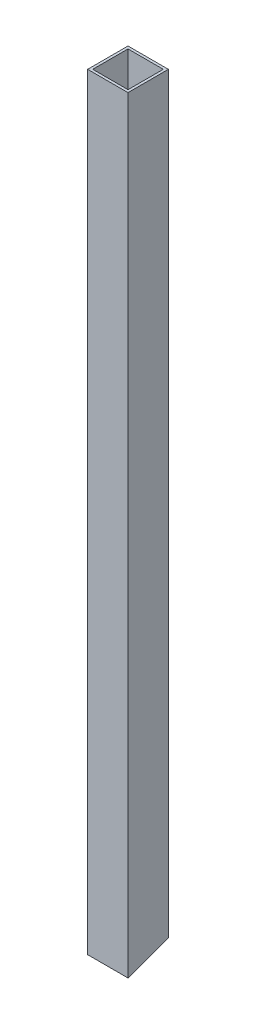
ISO-10303-21;
HEADER;
FILE_DESCRIPTION(('STEP AP214'),'2;1');
FILE_NAME('part.step','',(''),(''),'','','');
FILE_SCHEMA(('AUTOMOTIVE_DESIGN { 1 0 10303 214 1 1 1 1 }'));
ENDSEC;
DATA;
#1=APPLICATION_CONTEXT('core data for automotive mechanical design processes');
#2=APPLICATION_PROTOCOL_DEFINITION('international standard','automotive_design',2000,#1);
#3=PRODUCT_CONTEXT('',#1,'mechanical');
#4=PRODUCT('Part','Part','',(#3));
#5=PRODUCT_RELATED_PRODUCT_CATEGORY('part','',(#4));
#6=PRODUCT_DEFINITION_FORMATION('','',#4);
#7=PRODUCT_DEFINITION_CONTEXT('part definition',#1,'design');
#8=PRODUCT_DEFINITION('design','',#6,#7);
#9=PRODUCT_DEFINITION_SHAPE('','',#8);
#10=(LENGTH_UNIT() NAMED_UNIT(*) SI_UNIT(.MILLI.,.METRE.));
#11=(NAMED_UNIT(*) PLANE_ANGLE_UNIT() SI_UNIT($,.RADIAN.));
#12=(NAMED_UNIT(*) SI_UNIT($,.STERADIAN.) SOLID_ANGLE_UNIT());
#13=UNCERTAINTY_MEASURE_WITH_UNIT(LENGTH_MEASURE(1.E-05),#10,'distance_accuracy_value','');
#14=(GEOMETRIC_REPRESENTATION_CONTEXT(3) GLOBAL_UNCERTAINTY_ASSIGNED_CONTEXT((#13)) GLOBAL_UNIT_ASSIGNED_CONTEXT((#10,
#11,#12)) REPRESENTATION_CONTEXT('',''));
#15=CARTESIAN_POINT('',(0.,0.,0.));
#16=DIRECTION('',(0.,0.,1.));
#17=DIRECTION('',(1.,0.,0.));
#18=AXIS2_PLACEMENT_3D('',#15,#16,#17);
#19=CARTESIAN_POINT('',(0.,482.6,0.));
#20=DIRECTION('',(0.,-1.,0.));
#21=DIRECTION('',(0.,0.,-1.));
#22=AXIS2_PLACEMENT_3D('',#19,#20,#21);
#23=PLANE('',#22);
#24=DIRECTION('',(0.,0.,1.));
#25=VECTOR('',#24,1.);
#26=CARTESIAN_POINT('',(-12.7,482.6,-12.7));
#27=LINE('',#26,#25);
#28=CARTESIAN_POINT('',(-12.7,482.6,-12.7));
#29=VERTEX_POINT('',#28);
#30=CARTESIAN_POINT('',(-12.7,482.6,12.7));
#31=VERTEX_POINT('',#30);
#32=EDGE_CURVE('E130',#29,#31,#27,.T.);
#33=ORIENTED_EDGE('',*,*,#32,.T.);
#34=DIRECTION('',(1.,0.,0.));
#35=VECTOR('',#34,1.);
#36=CARTESIAN_POINT('',(12.7,482.6,12.7));
#37=LINE('',#36,#35);
#38=CARTESIAN_POINT('',(12.7,482.6,12.7));
#39=VERTEX_POINT('',#38);
#40=EDGE_CURVE('E126',#31,#39,#37,.T.);
#41=ORIENTED_EDGE('',*,*,#40,.T.);
#42=DIRECTION('',(0.,0.,-1.));
#43=VECTOR('',#42,1.);
#44=CARTESIAN_POINT('',(12.7,482.6,-12.7));
#45=LINE('',#44,#43);
#46=CARTESIAN_POINT('',(12.7,482.6,-12.7));
#47=VERTEX_POINT('',#46);
#48=EDGE_CURVE('E160',#39,#47,#45,.T.);
#49=ORIENTED_EDGE('',*,*,#48,.T.);
#50=DIRECTION('',(-1.,0.,0.));
#51=VECTOR('',#50,1.);
#52=CARTESIAN_POINT('',(12.7,482.6,-12.7));
#53=LINE('',#52,#51);
#54=EDGE_CURVE('E115',#47,#29,#53,.T.);
#55=ORIENTED_EDGE('',*,*,#54,.T.);
#56=EDGE_LOOP('',(#33,#41,#49,#55));
#57=FACE_BOUND('',#56,.T.);
#58=DIRECTION('',(0.,0.,1.));
#59=VECTOR('',#58,1.);
#60=CARTESIAN_POINT('',(-11.1125,482.6,11.1125));
#61=LINE('',#60,#59);
#62=CARTESIAN_POINT('',(-11.1125,482.6,-11.1125));
#63=VERTEX_POINT('',#62);
#64=CARTESIAN_POINT('',(-11.1125,482.6,11.1125));
#65=VERTEX_POINT('',#64);
#66=EDGE_CURVE('E131',#63,#65,#61,.T.);
#67=ORIENTED_EDGE('',*,*,#66,.F.);
#68=DIRECTION('',(-1.,0.,0.));
#69=VECTOR('',#68,1.);
#70=CARTESIAN_POINT('',(11.1125,482.6,-11.1125));
#71=LINE('',#70,#69);
#72=CARTESIAN_POINT('',(11.1125,482.6,-11.1125));
#73=VERTEX_POINT('',#72);
#74=EDGE_CURVE('E144',#73,#63,#71,.T.);
#75=ORIENTED_EDGE('',*,*,#74,.F.);
#76=DIRECTION('',(0.,0.,-1.));
#77=VECTOR('',#76,1.);
#78=CARTESIAN_POINT('',(11.1125,482.6,11.1125));
#79=LINE('',#78,#77);
#80=CARTESIAN_POINT('',(11.1125,482.6,11.1125));
#81=VERTEX_POINT('',#80);
#82=EDGE_CURVE('E141',#81,#73,#79,.T.);
#83=ORIENTED_EDGE('',*,*,#82,.F.);
#84=DIRECTION('',(1.,0.,0.));
#85=VECTOR('',#84,1.);
#86=CARTESIAN_POINT('',(11.1125,482.6,11.1125));
#87=LINE('',#86,#85);
#88=EDGE_CURVE('E134',#65,#81,#87,.T.);
#89=ORIENTED_EDGE('',*,*,#88,.F.);
#90=EDGE_LOOP('',(#67,#75,#83,#89));
#91=FACE_BOUND('',#90,.T.);
#92=ADVANCED_FACE('F33',(#57,#91),#23,.F.);
#93=CARTESIAN_POINT('',(-12.7,482.6,-12.7));
#94=DIRECTION('',(1.,0.,0.));
#95=DIRECTION('',(0.,0.,-1.));
#96=AXIS2_PLACEMENT_3D('',#93,#94,#95);
#97=PLANE('',#96);
#98=DIRECTION('',(0.,-1.,0.));
#99=VECTOR('',#98,1.);
#100=CARTESIAN_POINT('',(-12.7,482.6,-12.7));
#101=LINE('',#100,#99);
#102=CARTESIAN_POINT('',(-12.7,9.24484395036146,-12.7));
#103=VERTEX_POINT('',#102);
#104=EDGE_CURVE('E116',#29,#103,#101,.T.);
#105=ORIENTED_EDGE('',*,*,#104,.T.);
#106=DIRECTION('',(0.,-0.342020143325662,0.939692620785911));
#107=VECTOR('',#106,1.);
#108=CARTESIAN_POINT('',(-12.7,64.6168785184075,-164.833414644971));
#109=LINE('',#108,#107);
#110=CARTESIAN_POINT('',(-12.7000000000001,0.,12.7));
#111=VERTEX_POINT('',#110);
#112=EDGE_CURVE('E48',#103,#111,#109,.T.);
#113=ORIENTED_EDGE('',*,*,#112,.T.);
#114=DIRECTION('',(0.,-1.,0.));
#115=VECTOR('',#114,1.);
#116=CARTESIAN_POINT('',(-12.7,482.6,12.7));
#117=LINE('',#116,#115);
#118=EDGE_CURVE('E41',#31,#111,#117,.T.);
#119=ORIENTED_EDGE('',*,*,#118,.F.);
#120=ORIENTED_EDGE('',*,*,#32,.F.);
#121=EDGE_LOOP('',(#105,#113,#119,#120));
#122=FACE_BOUND('',#121,.T.);
#123=ADVANCED_FACE('F35',(#122),#97,.F.);
#124=CARTESIAN_POINT('',(12.7,482.6,12.7));
#125=DIRECTION('',(0.,0.,-1.));
#126=DIRECTION('',(-1.,0.,0.));
#127=AXIS2_PLACEMENT_3D('',#124,#125,#126);
#128=PLANE('',#127);
#129=DIRECTION('',(1.,0.,0.));
#130=VECTOR('',#129,1.);
#131=CARTESIAN_POINT('',(12.7,0.,12.7));
#132=LINE('',#131,#130);
#133=CARTESIAN_POINT('',(12.7,0.,12.7));
#134=VERTEX_POINT('',#133);
#135=EDGE_CURVE('E125',#111,#134,#132,.T.);
#136=ORIENTED_EDGE('',*,*,#135,.T.);
#137=DIRECTION('',(0.,-1.,0.));
#138=VECTOR('',#137,1.);
#139=CARTESIAN_POINT('',(12.7,482.6,12.7));
#140=LINE('',#139,#138);
#141=EDGE_CURVE('E112',#39,#134,#140,.T.);
#142=ORIENTED_EDGE('',*,*,#141,.F.);
#143=ORIENTED_EDGE('',*,*,#40,.F.);
#144=ORIENTED_EDGE('',*,*,#118,.T.);
#145=EDGE_LOOP('',(#136,#142,#143,#144));
#146=FACE_BOUND('',#145,.T.);
#147=ADVANCED_FACE('F124',(#146),#128,.F.);
#148=CARTESIAN_POINT('',(12.7,482.6,-12.7));
#149=DIRECTION('',(-1.,0.,0.));
#150=DIRECTION('',(0.,0.,1.));
#151=AXIS2_PLACEMENT_3D('',#148,#149,#150);
#152=PLANE('',#151);
#153=ORIENTED_EDGE('',*,*,#141,.T.);
#154=DIRECTION('',(0.,-0.342020143325663,0.939692620785911));
#155=VECTOR('',#154,1.);
#156=CARTESIAN_POINT('',(12.7,0.,12.7));
#157=LINE('',#156,#155);
#158=CARTESIAN_POINT('',(12.7,9.24484395036135,-12.7));
#159=VERTEX_POINT('',#158);
#160=EDGE_CURVE('E97',#159,#134,#157,.T.);
#161=ORIENTED_EDGE('',*,*,#160,.F.);
#162=DIRECTION('',(0.,-1.,0.));
#163=VECTOR('',#162,1.);
#164=CARTESIAN_POINT('',(12.7,482.6,-12.7));
#165=LINE('',#164,#163);
#166=EDGE_CURVE('E109',#47,#159,#165,.T.);
#167=ORIENTED_EDGE('',*,*,#166,.F.);
#168=ORIENTED_EDGE('',*,*,#48,.F.);
#169=EDGE_LOOP('',(#153,#161,#167,#168));
#170=FACE_BOUND('',#169,.T.);
#171=ADVANCED_FACE('F107',(#170),#152,.F.);
#172=CARTESIAN_POINT('',(12.7,482.6,-12.7));
#173=DIRECTION('',(0.,0.,1.));
#174=DIRECTION('',(1.,0.,0.));
#175=AXIS2_PLACEMENT_3D('',#172,#173,#174);
#176=PLANE('',#175);
#177=ORIENTED_EDGE('',*,*,#166,.T.);
#178=DIRECTION('',(1.,0.,0.));
#179=VECTOR('',#178,1.);
#180=CARTESIAN_POINT('',(-469.9,9.24484395036135,-12.7));
#181=LINE('',#180,#179);
#182=EDGE_CURVE('E94',#103,#159,#181,.T.);
#183=ORIENTED_EDGE('',*,*,#182,.F.);
#184=ORIENTED_EDGE('',*,*,#104,.F.);
#185=ORIENTED_EDGE('',*,*,#54,.F.);
#186=EDGE_LOOP('',(#177,#183,#184,#185));
#187=FACE_BOUND('',#186,.T.);
#188=ADVANCED_FACE('F114',(#187),#176,.F.);
#189=CARTESIAN_POINT('',(-11.1125,482.6,11.1125));
#190=DIRECTION('',(1.,0.,0.));
#191=DIRECTION('',(0.,0.,-1.));
#192=AXIS2_PLACEMENT_3D('',#189,#190,#191);
#193=PLANE('',#192);
#194=DIRECTION('',(0.,-0.342020143325662,0.939692620785911));
#195=VECTOR('',#194,1.);
#196=CARTESIAN_POINT('',(-11.1125,56.9636885405772,-143.806447994085));
#197=LINE('',#196,#195);
#198=CARTESIAN_POINT('',(-11.1125,8.66704120346373,-11.1125));
#199=VERTEX_POINT('',#198);
#200=CARTESIAN_POINT('',(-11.1125,0.57780274689756,11.1125));
#201=VERTEX_POINT('',#200);
#202=EDGE_CURVE('E132',#199,#201,#197,.T.);
#203=ORIENTED_EDGE('',*,*,#202,.F.);
#204=DIRECTION('',(0.,-1.,0.));
#205=VECTOR('',#204,1.);
#206=CARTESIAN_POINT('',(-11.1125,482.6,-11.1125));
#207=LINE('',#206,#205);
#208=EDGE_CURVE('E146',#63,#199,#207,.T.);
#209=ORIENTED_EDGE('',*,*,#208,.F.);
#210=ORIENTED_EDGE('',*,*,#66,.T.);
#211=DIRECTION('',(0.,-1.,0.));
#212=VECTOR('',#211,1.);
#213=CARTESIAN_POINT('',(-11.1125,482.6,11.1125));
#214=LINE('',#213,#212);
#215=EDGE_CURVE('E155',#65,#201,#214,.T.);
#216=ORIENTED_EDGE('',*,*,#215,.T.);
#217=EDGE_LOOP('',(#203,#209,#210,#216));
#218=FACE_BOUND('',#217,.T.);
#219=ADVANCED_FACE('F174',(#218),#193,.T.);
#220=CARTESIAN_POINT('',(11.1125,482.6,11.1125));
#221=DIRECTION('',(0.,0.,-1.));
#222=DIRECTION('',(-1.,0.,0.));
#223=AXIS2_PLACEMENT_3D('',#220,#221,#222);
#224=PLANE('',#223);
#225=DIRECTION('',(1.,0.,0.));
#226=VECTOR('',#225,1.);
#227=CARTESIAN_POINT('',(11.1125,0.57780274689756,11.1125));
#228=LINE('',#227,#226);
#229=CARTESIAN_POINT('',(11.1125,0.577802746897588,11.1125));
#230=VERTEX_POINT('',#229);
#231=EDGE_CURVE('E136',#201,#230,#228,.T.);
#232=ORIENTED_EDGE('',*,*,#231,.F.);
#233=ORIENTED_EDGE('',*,*,#215,.F.);
#234=ORIENTED_EDGE('',*,*,#88,.T.);
#235=DIRECTION('',(0.,-1.,0.));
#236=VECTOR('',#235,1.);
#237=CARTESIAN_POINT('',(11.1125,482.6,11.1125));
#238=LINE('',#237,#236);
#239=EDGE_CURVE('E152',#81,#230,#238,.T.);
#240=ORIENTED_EDGE('',*,*,#239,.T.);
#241=EDGE_LOOP('',(#232,#233,#234,#240));
#242=FACE_BOUND('',#241,.T.);
#243=ADVANCED_FACE('F177',(#242),#224,.T.);
#244=CARTESIAN_POINT('',(11.1125,482.6,11.1125));
#245=DIRECTION('',(-1.,0.,0.));
#246=DIRECTION('',(0.,0.,1.));
#247=AXIS2_PLACEMENT_3D('',#244,#245,#246);
#248=PLANE('',#247);
#249=DIRECTION('',(0.,0.342020143325662,-0.939692620785911));
#250=VECTOR('',#249,1.);
#251=CARTESIAN_POINT('',(11.1125,56.9636885405772,-143.806447994085));
#252=LINE('',#251,#250);
#253=CARTESIAN_POINT('',(11.1125,8.66704120346384,-11.1125));
#254=VERTEX_POINT('',#253);
#255=EDGE_CURVE('E55',#230,#254,#252,.T.);
#256=ORIENTED_EDGE('',*,*,#255,.F.);
#257=ORIENTED_EDGE('',*,*,#239,.F.);
#258=ORIENTED_EDGE('',*,*,#82,.T.);
#259=DIRECTION('',(0.,-1.,0.));
#260=VECTOR('',#259,1.);
#261=CARTESIAN_POINT('',(11.1125,482.6,-11.1125));
#262=LINE('',#261,#260);
#263=EDGE_CURVE('E149',#73,#254,#262,.T.);
#264=ORIENTED_EDGE('',*,*,#263,.T.);
#265=EDGE_LOOP('',(#256,#257,#258,#264));
#266=FACE_BOUND('',#265,.T.);
#267=ADVANCED_FACE('F181',(#266),#248,.T.);
#268=CARTESIAN_POINT('',(11.1125,482.6,-11.1125));
#269=DIRECTION('',(0.,0.,1.));
#270=DIRECTION('',(1.,0.,0.));
#271=AXIS2_PLACEMENT_3D('',#268,#269,#270);
#272=PLANE('',#271);
#273=DIRECTION('',(-1.,0.,0.));
#274=VECTOR('',#273,1.);
#275=CARTESIAN_POINT('',(11.1125,8.66704120346373,-11.1125));
#276=LINE('',#275,#274);
#277=EDGE_CURVE('E11',#254,#199,#276,.T.);
#278=ORIENTED_EDGE('',*,*,#277,.F.);
#279=ORIENTED_EDGE('',*,*,#263,.F.);
#280=ORIENTED_EDGE('',*,*,#74,.T.);
#281=ORIENTED_EDGE('',*,*,#208,.T.);
#282=EDGE_LOOP('',(#278,#279,#280,#281));
#283=FACE_BOUND('',#282,.T.);
#284=ADVANCED_FACE('F183',(#283),#272,.T.);
#285=CARTESIAN_POINT('',(-469.9,0.,12.7));
#286=DIRECTION('',(0.,0.939692620785911,0.342020143325662));
#287=DIRECTION('',(0.,-0.342020143325662,0.939692620785911));
#288=AXIS2_PLACEMENT_3D('',#285,#286,#287);
#289=PLANE('',#288);
#290=ORIENTED_EDGE('',*,*,#202,.T.);
#291=ORIENTED_EDGE('',*,*,#231,.T.);
#292=ORIENTED_EDGE('',*,*,#255,.T.);
#293=ORIENTED_EDGE('',*,*,#277,.T.);
#294=EDGE_LOOP('',(#290,#291,#292,#293));
#295=FACE_BOUND('',#294,.T.);
#296=ORIENTED_EDGE('',*,*,#182,.T.);
#297=ORIENTED_EDGE('',*,*,#160,.T.);
#298=ORIENTED_EDGE('',*,*,#135,.F.);
#299=ORIENTED_EDGE('',*,*,#112,.F.);
#300=EDGE_LOOP('',(#296,#297,#298,#299));
#301=FACE_BOUND('',#300,.T.);
#302=ADVANCED_FACE('F96',(#295,#301),#289,.F.);
#303=CLOSED_SHELL('',(#92,#123,#147,#171,#188,#219,#243,#267,#284,#302));
#304=MANIFOLD_SOLID_BREP('B2',#303);
#305=ADVANCED_BREP_SHAPE_REPRESENTATION('',(#18,#304),#14);
#306=SHAPE_DEFINITION_REPRESENTATION(#9,#305);
ENDSEC;
END-ISO-10303-21;
